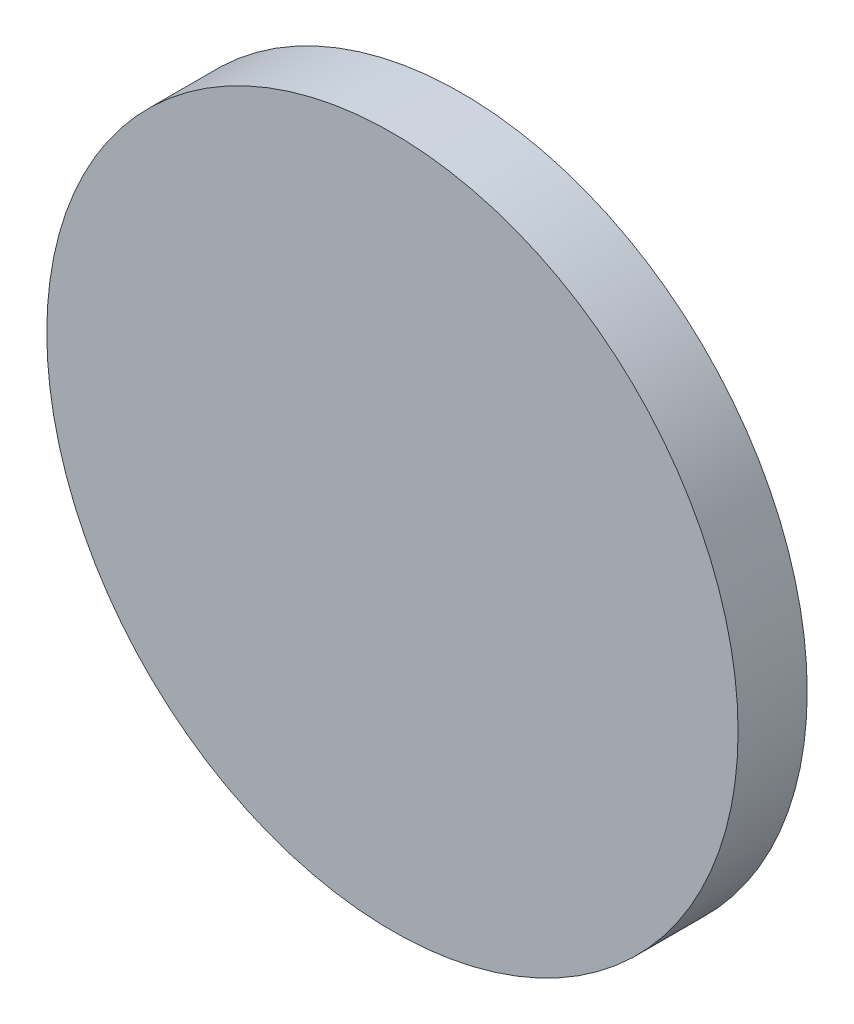
ISO-10303-21;
HEADER;
FILE_DESCRIPTION(('STEP AP214'),'2;1');
FILE_NAME('part.step','',(''),(''),'','','');
FILE_SCHEMA(('AUTOMOTIVE_DESIGN { 1 0 10303 214 1 1 1 1 }'));
ENDSEC;
DATA;
#1=APPLICATION_CONTEXT('core data for automotive mechanical design processes');
#2=APPLICATION_PROTOCOL_DEFINITION('international standard','automotive_design',2000,#1);
#3=PRODUCT_CONTEXT('',#1,'mechanical');
#4=PRODUCT('Part','Part','',(#3));
#5=PRODUCT_RELATED_PRODUCT_CATEGORY('part','',(#4));
#6=PRODUCT_DEFINITION_FORMATION('','',#4);
#7=PRODUCT_DEFINITION_CONTEXT('part definition',#1,'design');
#8=PRODUCT_DEFINITION('design','',#6,#7);
#9=PRODUCT_DEFINITION_SHAPE('','',#8);
#10=(LENGTH_UNIT() NAMED_UNIT(*) SI_UNIT(.MILLI.,.METRE.));
#11=(NAMED_UNIT(*) PLANE_ANGLE_UNIT() SI_UNIT($,.RADIAN.));
#12=(NAMED_UNIT(*) SI_UNIT($,.STERADIAN.) SOLID_ANGLE_UNIT());
#13=UNCERTAINTY_MEASURE_WITH_UNIT(LENGTH_MEASURE(1.E-05),#10,'distance_accuracy_value','');
#14=(GEOMETRIC_REPRESENTATION_CONTEXT(3) GLOBAL_UNCERTAINTY_ASSIGNED_CONTEXT((#13)) GLOBAL_UNIT_ASSIGNED_CONTEXT((#10,
#11,#12)) REPRESENTATION_CONTEXT('',''));
#15=CARTESIAN_POINT('',(0.,0.,0.));
#16=DIRECTION('',(0.,0.,1.));
#17=DIRECTION('',(1.,0.,0.));
#18=AXIS2_PLACEMENT_3D('',#15,#16,#17);
#19=CARTESIAN_POINT('',(-181.5,-45.4999999999996,0.5));
#20=DIRECTION('',(0.,0.,-1.));
#21=DIRECTION('',(-1.,0.,0.));
#22=AXIS2_PLACEMENT_3D('',#19,#20,#21);
#23=CYLINDRICAL_SURFACE('',#22,2.5);
#24=CARTESIAN_POINT('',(-181.5,-45.4999999999996,0.5));
#25=DIRECTION('',(0.,0.,1.));
#26=DIRECTION('',(1.,0.,0.));
#27=AXIS2_PLACEMENT_3D('',#24,#25,#26);
#28=CIRCLE('',#27,2.5);
#29=CARTESIAN_POINT('',(-179.,-45.4999999999996,0.5));
#30=VERTEX_POINT('',#29);
#31=EDGE_CURVE('E10',#30,#30,#28,.T.);
#32=ORIENTED_EDGE('',*,*,#31,.F.);
#33=EDGE_LOOP('',(#32));
#34=FACE_BOUND('',#33,.T.);
#35=CARTESIAN_POINT('',(-181.5,-45.4999999999996,0.));
#36=DIRECTION('',(0.,0.,1.));
#37=DIRECTION('',(1.,0.,0.));
#38=AXIS2_PLACEMENT_3D('',#35,#36,#37);
#39=CIRCLE('',#38,2.5);
#40=CARTESIAN_POINT('',(-179.,-45.4999999999996,0.));
#41=VERTEX_POINT('',#40);
#42=EDGE_CURVE('E36',#41,#41,#39,.T.);
#43=ORIENTED_EDGE('',*,*,#42,.T.);
#44=EDGE_LOOP('',(#43));
#45=FACE_BOUND('',#44,.T.);
#46=ADVANCED_FACE('F33',(#34,#45),#23,.T.);
#47=CARTESIAN_POINT('',(-181.5,-45.4999999999996,0.5));
#48=DIRECTION('',(0.,0.,1.));
#49=DIRECTION('',(1.,0.,0.));
#50=AXIS2_PLACEMENT_3D('',#47,#48,#49);
#51=PLANE('',#50);
#52=ORIENTED_EDGE('',*,*,#31,.T.);
#53=EDGE_LOOP('',(#52));
#54=FACE_BOUND('',#53,.T.);
#55=ADVANCED_FACE('F48',(#54),#51,.T.);
#56=CARTESIAN_POINT('',(-181.5,-45.4999999999996,0.));
#57=DIRECTION('',(0.,0.,1.));
#58=DIRECTION('',(1.,0.,0.));
#59=AXIS2_PLACEMENT_3D('',#56,#57,#58);
#60=PLANE('',#59);
#61=ORIENTED_EDGE('',*,*,#42,.F.);
#62=EDGE_LOOP('',(#61));
#63=FACE_BOUND('',#62,.T.);
#64=ADVANCED_FACE('F46',(#63),#60,.F.);
#65=CLOSED_SHELL('',(#46,#55,#64));
#66=MANIFOLD_SOLID_BREP('B2',#65);
#67=ADVANCED_BREP_SHAPE_REPRESENTATION('',(#18,#66),#14);
#68=SHAPE_DEFINITION_REPRESENTATION(#9,#67);
ENDSEC;
END-ISO-10303-21;
